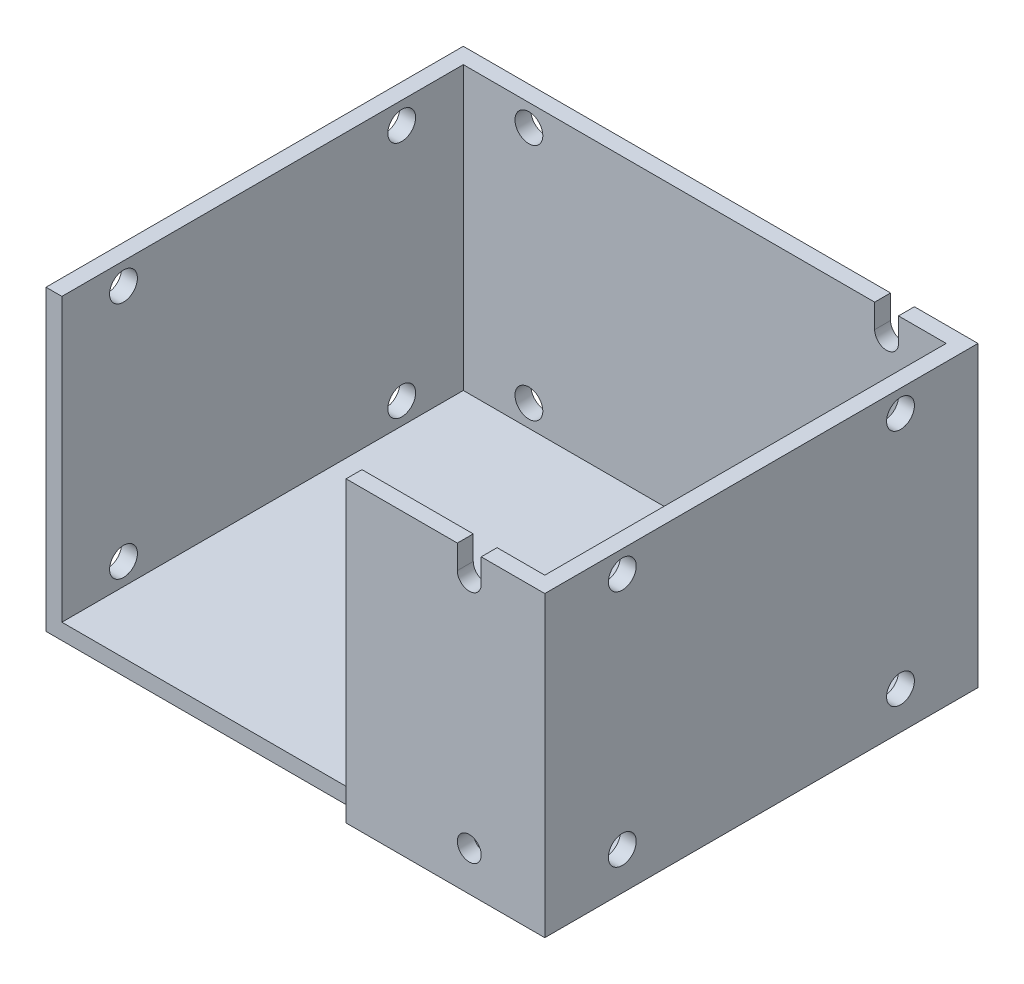
ISO-10303-21;
HEADER;
FILE_DESCRIPTION(('STEP AP214'),'2;1');
FILE_NAME('part.step','',(''),(''),'','','');
FILE_SCHEMA(('AUTOMOTIVE_DESIGN { 1 0 10303 214 1 1 1 1 }'));
ENDSEC;
DATA;
#1=APPLICATION_CONTEXT('core data for automotive mechanical design processes');
#2=APPLICATION_PROTOCOL_DEFINITION('international standard','automotive_design',2000,#1);
#3=PRODUCT_CONTEXT('',#1,'mechanical');
#4=PRODUCT('Part','Part','',(#3));
#5=PRODUCT_RELATED_PRODUCT_CATEGORY('part','',(#4));
#6=PRODUCT_DEFINITION_FORMATION('','',#4);
#7=PRODUCT_DEFINITION_CONTEXT('part definition',#1,'design');
#8=PRODUCT_DEFINITION('design','',#6,#7);
#9=PRODUCT_DEFINITION_SHAPE('','',#8);
#10=(LENGTH_UNIT() NAMED_UNIT(*) SI_UNIT(.MILLI.,.METRE.));
#11=(NAMED_UNIT(*) PLANE_ANGLE_UNIT() SI_UNIT($,.RADIAN.));
#12=(NAMED_UNIT(*) SI_UNIT($,.STERADIAN.) SOLID_ANGLE_UNIT());
#13=UNCERTAINTY_MEASURE_WITH_UNIT(LENGTH_MEASURE(1.E-05),#10,'distance_accuracy_value','');
#14=(GEOMETRIC_REPRESENTATION_CONTEXT(3) GLOBAL_UNCERTAINTY_ASSIGNED_CONTEXT((#13)) GLOBAL_UNIT_ASSIGNED_CONTEXT((#10,
#11,#12)) REPRESENTATION_CONTEXT('',''));
#15=CARTESIAN_POINT('',(0.,0.,0.));
#16=DIRECTION('',(0.,0.,1.));
#17=DIRECTION('',(1.,0.,0.));
#18=AXIS2_PLACEMENT_3D('',#15,#16,#17);
#19=CARTESIAN_POINT('',(0.,75.,0.));
#20=DIRECTION('',(0.,-1.,0.));
#21=DIRECTION('',(0.,0.,-1.));
#22=AXIS2_PLACEMENT_3D('',#19,#20,#21);
#23=PLANE('',#22);
#24=DIRECTION('',(0.,0.,-1.));
#25=VECTOR('',#24,1.);
#26=CARTESIAN_POINT('',(48.75,75.,65.316653826392));
#27=LINE('',#26,#25);
#28=CARTESIAN_POINT('',(48.75,75.,54.5));
#29=VERTEX_POINT('',#28);
#30=CARTESIAN_POINT('',(48.75,75.,50.5));
#31=VERTEX_POINT('',#30);
#32=EDGE_CURVE('E183',#29,#31,#27,.T.);
#33=ORIENTED_EDGE('',*,*,#32,.F.);
#34=DIRECTION('',(1.,0.,0.));
#35=VECTOR('',#34,1.);
#36=CARTESIAN_POINT('',(64.75,75.,54.5));
#37=LINE('',#36,#35);
#38=CARTESIAN_POINT('',(64.75,75.,54.5));
#39=VERTEX_POINT('',#38);
#40=EDGE_CURVE('E331',#29,#39,#37,.T.);
#41=ORIENTED_EDGE('',*,*,#40,.T.);
#42=DIRECTION('',(0.,0.,-1.));
#43=VECTOR('',#42,1.);
#44=CARTESIAN_POINT('',(64.75,75.,-54.5));
#45=LINE('',#44,#43);
#46=CARTESIAN_POINT('',(64.75,75.,-54.5));
#47=VERTEX_POINT('',#46);
#48=EDGE_CURVE('E197',#39,#47,#45,.T.);
#49=ORIENTED_EDGE('',*,*,#48,.T.);
#50=DIRECTION('',(-1.,0.,0.));
#51=VECTOR('',#50,1.);
#52=CARTESIAN_POINT('',(64.75,75.,-54.5));
#53=LINE('',#52,#51);
#54=CARTESIAN_POINT('',(48.75,75.,-54.5));
#55=VERTEX_POINT('',#54);
#56=EDGE_CURVE('E190',#47,#55,#53,.T.);
#57=ORIENTED_EDGE('',*,*,#56,.T.);
#58=CARTESIAN_POINT('',(48.75,75.,-50.5));
#59=VERTEX_POINT('',#58);
#60=EDGE_CURVE('E171',#59,#55,#27,.T.);
#61=ORIENTED_EDGE('',*,*,#60,.F.);
#62=DIRECTION('',(1.,0.,0.));
#63=VECTOR('',#62,1.);
#64=CARTESIAN_POINT('',(60.75,75.,-50.5));
#65=LINE('',#64,#63);
#66=CARTESIAN_POINT('',(60.75,75.,-50.5));
#67=VERTEX_POINT('',#66);
#68=EDGE_CURVE('E215',#59,#67,#65,.T.);
#69=ORIENTED_EDGE('',*,*,#68,.T.);
#70=DIRECTION('',(0.,0.,1.));
#71=VECTOR('',#70,1.);
#72=CARTESIAN_POINT('',(60.75,75.,50.5));
#73=LINE('',#72,#71);
#74=CARTESIAN_POINT('',(60.75,75.,50.5));
#75=VERTEX_POINT('',#74);
#76=EDGE_CURVE('E220',#67,#75,#73,.T.);
#77=ORIENTED_EDGE('',*,*,#76,.T.);
#78=DIRECTION('',(-1.,0.,0.));
#79=VECTOR('',#78,1.);
#80=CARTESIAN_POINT('',(14.75,75.,50.5));
#81=LINE('',#80,#79);
#82=EDGE_CURVE('E332',#75,#31,#81,.T.);
#83=ORIENTED_EDGE('',*,*,#82,.T.);
#84=EDGE_LOOP('',(#33,#41,#49,#57,#61,#69,#77,#83));
#85=FACE_BOUND('',#84,.T.);
#86=ADVANCED_FACE('F39',(#85),#23,.F.);
#87=CARTESIAN_POINT('',(14.75,75.,54.5));
#88=VERTEX_POINT('',#87);
#89=CARTESIAN_POINT('',(42.75,75.,54.5));
#90=VERTEX_POINT('',#89);
#91=EDGE_CURVE('E312',#88,#90,#37,.T.);
#92=ORIENTED_EDGE('',*,*,#91,.T.);
#93=DIRECTION('',(0.,0.,-1.));
#94=VECTOR('',#93,1.);
#95=CARTESIAN_POINT('',(42.75,75.,65.316653826392));
#96=LINE('',#95,#94);
#97=CARTESIAN_POINT('',(42.75,75.,50.5));
#98=VERTEX_POINT('',#97);
#99=EDGE_CURVE('E66',#90,#98,#96,.T.);
#100=ORIENTED_EDGE('',*,*,#99,.T.);
#101=CARTESIAN_POINT('',(14.75,75.,50.5));
#102=VERTEX_POINT('',#101);
#103=EDGE_CURVE('E306',#98,#102,#81,.T.);
#104=ORIENTED_EDGE('',*,*,#103,.T.);
#105=DIRECTION('',(0.,0.,1.));
#106=VECTOR('',#105,1.);
#107=CARTESIAN_POINT('',(14.75,75.,54.5));
#108=LINE('',#107,#106);
#109=EDGE_CURVE('E328',#102,#88,#108,.T.);
#110=ORIENTED_EDGE('',*,*,#109,.T.);
#111=EDGE_LOOP('',(#92,#100,#104,#110));
#112=FACE_BOUND('',#111,.T.);
#113=ADVANCED_FACE('F529',(#112),#23,.F.);
#114=CARTESIAN_POINT('',(-60.75,4.,50.5));
#115=DIRECTION('',(0.,0.,-1.));
#116=DIRECTION('',(-1.,0.,0.));
#117=AXIS2_PLACEMENT_3D('',#114,#115,#116);
#118=PLANE('',#117);
#119=DIRECTION('',(0.,-1.,0.));
#120=VECTOR('',#119,1.);
#121=CARTESIAN_POINT('',(14.75,75.,50.5));
#122=LINE('',#121,#120);
#123=CARTESIAN_POINT('',(14.75,4.,50.5));
#124=VERTEX_POINT('',#123);
#125=CARTESIAN_POINT('',(14.75,0.,50.5));
#126=VERTEX_POINT('',#125);
#127=EDGE_CURVE('E11',#124,#126,#122,.T.);
#128=ORIENTED_EDGE('',*,*,#127,.F.);
#129=DIRECTION('',(1.,0.,0.));
#130=VECTOR('',#129,1.);
#131=CARTESIAN_POINT('',(-60.75,4.,50.5));
#132=LINE('',#131,#130);
#133=CARTESIAN_POINT('',(-60.75,4.,50.5));
#134=VERTEX_POINT('',#133);
#135=EDGE_CURVE('E261',#134,#124,#132,.T.);
#136=ORIENTED_EDGE('',*,*,#135,.F.);
#137=DIRECTION('',(0.,-1.,0.));
#138=VECTOR('',#137,1.);
#139=CARTESIAN_POINT('',(-60.75,75.,50.5));
#140=LINE('',#139,#138);
#141=CARTESIAN_POINT('',(-60.75,75.,50.5));
#142=VERTEX_POINT('',#141);
#143=EDGE_CURVE('E250',#142,#134,#140,.T.);
#144=ORIENTED_EDGE('',*,*,#143,.F.);
#145=DIRECTION('',(1.,0.,0.));
#146=VECTOR('',#145,1.);
#147=CARTESIAN_POINT('',(-60.75,75.,50.5));
#148=LINE('',#147,#146);
#149=CARTESIAN_POINT('',(-64.75,75.,50.5));
#150=VERTEX_POINT('',#149);
#151=EDGE_CURVE('E205',#150,#142,#148,.T.);
#152=ORIENTED_EDGE('',*,*,#151,.F.);
#153=DIRECTION('',(0.,-1.,0.));
#154=VECTOR('',#153,1.);
#155=CARTESIAN_POINT('',(-64.75,75.,50.5));
#156=LINE('',#155,#154);
#157=CARTESIAN_POINT('',(-64.75,0.,50.5));
#158=VERTEX_POINT('',#157);
#159=EDGE_CURVE('E253',#150,#158,#156,.T.);
#160=ORIENTED_EDGE('',*,*,#159,.T.);
#161=DIRECTION('',(1.,0.,0.));
#162=VECTOR('',#161,1.);
#163=CARTESIAN_POINT('',(-60.75,0.,50.5));
#164=LINE('',#163,#162);
#165=EDGE_CURVE('E43',#158,#126,#164,.T.);
#166=ORIENTED_EDGE('',*,*,#165,.T.);
#167=EDGE_LOOP('',(#128,#136,#144,#152,#160,#166));
#168=FACE_BOUND('',#167,.T.);
#169=ADVANCED_FACE('F41',(#168),#118,.F.);
#170=CARTESIAN_POINT('',(0.,4.,0.));
#171=DIRECTION('',(0.,-1.,0.));
#172=DIRECTION('',(0.,0.,-1.));
#173=AXIS2_PLACEMENT_3D('',#170,#171,#172);
#174=PLANE('',#173);
#175=ORIENTED_EDGE('',*,*,#135,.T.);
#176=CARTESIAN_POINT('',(60.75,4.,50.5));
#177=VERTEX_POINT('',#176);
#178=EDGE_CURVE('E266',#124,#177,#132,.T.);
#179=ORIENTED_EDGE('',*,*,#178,.T.);
#180=DIRECTION('',(0.,0.,1.));
#181=VECTOR('',#180,1.);
#182=CARTESIAN_POINT('',(60.75,4.,-50.5));
#183=LINE('',#182,#181);
#184=CARTESIAN_POINT('',(60.75,4.,-50.5));
#185=VERTEX_POINT('',#184);
#186=EDGE_CURVE('E265',#185,#177,#183,.T.);
#187=ORIENTED_EDGE('',*,*,#186,.F.);
#188=DIRECTION('',(1.,0.,0.));
#189=VECTOR('',#188,1.);
#190=CARTESIAN_POINT('',(-60.75,4.,-50.5));
#191=LINE('',#190,#189);
#192=CARTESIAN_POINT('',(-60.75,4.,-50.5));
#193=VERTEX_POINT('',#192);
#194=EDGE_CURVE('E270',#193,#185,#191,.T.);
#195=ORIENTED_EDGE('',*,*,#194,.F.);
#196=DIRECTION('',(0.,0.,1.));
#197=VECTOR('',#196,1.);
#198=CARTESIAN_POINT('',(-60.75,4.,-50.5));
#199=LINE('',#198,#197);
#200=EDGE_CURVE('E49',#193,#134,#199,.T.);
#201=ORIENTED_EDGE('',*,*,#200,.T.);
#202=EDGE_LOOP('',(#175,#179,#187,#195,#201));
#203=FACE_BOUND('',#202,.T.);
#204=ADVANCED_FACE('F277',(#203),#174,.F.);
#205=CARTESIAN_POINT('',(0.,0.,0.));
#206=DIRECTION('',(0.,-1.,0.));
#207=DIRECTION('',(0.,0.,-1.));
#208=AXIS2_PLACEMENT_3D('',#205,#206,#207);
#209=PLANE('',#208);
#210=ORIENTED_EDGE('',*,*,#165,.F.);
#211=DIRECTION('',(0.,0.,1.));
#212=VECTOR('',#211,1.);
#213=CARTESIAN_POINT('',(-64.75,0.,50.5));
#214=LINE('',#213,#212);
#215=CARTESIAN_POINT('',(-64.75,0.,-54.5));
#216=VERTEX_POINT('',#215);
#217=EDGE_CURVE('E229',#216,#158,#214,.T.);
#218=ORIENTED_EDGE('',*,*,#217,.F.);
#219=DIRECTION('',(-1.,0.,0.));
#220=VECTOR('',#219,1.);
#221=CARTESIAN_POINT('',(-64.75,0.,-54.5));
#222=LINE('',#221,#220);
#223=CARTESIAN_POINT('',(64.75,0.,-54.5));
#224=VERTEX_POINT('',#223);
#225=EDGE_CURVE('E226',#224,#216,#222,.T.);
#226=ORIENTED_EDGE('',*,*,#225,.F.);
#227=DIRECTION('',(0.,0.,-1.));
#228=VECTOR('',#227,1.);
#229=CARTESIAN_POINT('',(64.75,0.,-54.5));
#230=LINE('',#229,#228);
#231=CARTESIAN_POINT('',(64.75,0.,54.5));
#232=VERTEX_POINT('',#231);
#233=EDGE_CURVE('E207',#232,#224,#230,.T.);
#234=ORIENTED_EDGE('',*,*,#233,.F.);
#235=DIRECTION('',(1.,0.,0.));
#236=VECTOR('',#235,1.);
#237=CARTESIAN_POINT('',(64.75,0.,54.5));
#238=LINE('',#237,#236);
#239=CARTESIAN_POINT('',(14.75,0.,54.5));
#240=VERTEX_POINT('',#239);
#241=EDGE_CURVE('E300',#240,#232,#238,.T.);
#242=ORIENTED_EDGE('',*,*,#241,.F.);
#243=DIRECTION('',(0.,0.,1.));
#244=VECTOR('',#243,1.);
#245=CARTESIAN_POINT('',(14.75,0.,54.5));
#246=LINE('',#245,#244);
#247=EDGE_CURVE('E291',#126,#240,#246,.T.);
#248=ORIENTED_EDGE('',*,*,#247,.F.);
#249=EDGE_LOOP('',(#210,#218,#226,#234,#242,#248));
#250=FACE_BOUND('',#249,.T.);
#251=ADVANCED_FACE('F297',(#250),#209,.T.);
#252=CARTESIAN_POINT('',(-60.75,75.,-50.5));
#253=DIRECTION('',(-1.,0.,0.));
#254=DIRECTION('',(0.,0.,1.));
#255=AXIS2_PLACEMENT_3D('',#252,#253,#254);
#256=PLANE('',#255);
#257=CARTESIAN_POINT('',(-60.75,69.5,-35.));
#258=DIRECTION('',(-1.,0.,0.));
#259=DIRECTION('',(0.,0.,1.));
#260=AXIS2_PLACEMENT_3D('',#257,#258,#259);
#261=CIRCLE('',#260,3.5);
#262=CARTESIAN_POINT('',(-60.75,69.5,-31.5));
#263=VERTEX_POINT('',#262);
#264=EDGE_CURVE('E302',#263,#263,#261,.T.);
#265=ORIENTED_EDGE('',*,*,#264,.T.);
#266=EDGE_LOOP('',(#265));
#267=FACE_BOUND('',#266,.T.);
#268=CARTESIAN_POINT('',(-60.75,9.50000000000001,35.));
#269=DIRECTION('',(-1.,0.,0.));
#270=DIRECTION('',(0.,0.,1.));
#271=AXIS2_PLACEMENT_3D('',#268,#269,#270);
#272=CIRCLE('',#271,3.50000000000001);
#273=CARTESIAN_POINT('',(-60.75,9.50000000000001,38.5));
#274=VERTEX_POINT('',#273);
#275=EDGE_CURVE('E361',#274,#274,#272,.T.);
#276=ORIENTED_EDGE('',*,*,#275,.T.);
#277=EDGE_LOOP('',(#276));
#278=FACE_BOUND('',#277,.T.);
#279=CARTESIAN_POINT('',(-60.75,9.50000000000001,-35.));
#280=DIRECTION('',(-1.,0.,0.));
#281=DIRECTION('',(0.,0.,1.));
#282=AXIS2_PLACEMENT_3D('',#279,#280,#281);
#283=CIRCLE('',#282,3.5);
#284=CARTESIAN_POINT('',(-60.75,9.50000000000001,-31.5));
#285=VERTEX_POINT('',#284);
#286=EDGE_CURVE('E369',#285,#285,#283,.T.);
#287=ORIENTED_EDGE('',*,*,#286,.T.);
#288=EDGE_LOOP('',(#287));
#289=FACE_BOUND('',#288,.T.);
#290=CARTESIAN_POINT('',(-60.75,69.5,35.));
#291=DIRECTION('',(-1.,0.,0.));
#292=DIRECTION('',(0.,0.,1.));
#293=AXIS2_PLACEMENT_3D('',#290,#291,#292);
#294=CIRCLE('',#293,3.49999999999999);
#295=CARTESIAN_POINT('',(-60.75,69.5,38.5));
#296=VERTEX_POINT('',#295);
#297=EDGE_CURVE('E377',#296,#296,#294,.T.);
#298=ORIENTED_EDGE('',*,*,#297,.T.);
#299=EDGE_LOOP('',(#298));
#300=FACE_BOUND('',#299,.T.);
#301=ORIENTED_EDGE('',*,*,#143,.T.);
#302=ORIENTED_EDGE('',*,*,#200,.F.);
#303=DIRECTION('',(0.,-1.,0.));
#304=VECTOR('',#303,1.);
#305=CARTESIAN_POINT('',(-60.75,75.,-50.5));
#306=LINE('',#305,#304);
#307=CARTESIAN_POINT('',(-60.75,75.,-50.5));
#308=VERTEX_POINT('',#307);
#309=EDGE_CURVE('E246',#308,#193,#306,.T.);
#310=ORIENTED_EDGE('',*,*,#309,.F.);
#311=DIRECTION('',(0.,0.,-1.));
#312=VECTOR('',#311,1.);
#313=CARTESIAN_POINT('',(-60.75,75.,-50.5));
#314=LINE('',#313,#312);
#315=EDGE_CURVE('E212',#142,#308,#314,.T.);
#316=ORIENTED_EDGE('',*,*,#315,.F.);
#317=EDGE_LOOP('',(#301,#302,#310,#316));
#318=FACE_BOUND('',#317,.T.);
#319=ADVANCED_FACE('F517',(#267,#278,#289,#300,#318),#256,.F.);
#320=CARTESIAN_POINT('',(60.75,75.,-50.5));
#321=DIRECTION('',(0.,0.,-1.));
#322=DIRECTION('',(-1.,0.,0.));
#323=AXIS2_PLACEMENT_3D('',#320,#321,#322);
#324=PLANE('',#323);
#325=DIRECTION('',(0.,1.,0.));
#326=VECTOR('',#325,1.);
#327=CARTESIAN_POINT('',(48.75,75.,-50.5));
#328=LINE('',#327,#326);
#329=CARTESIAN_POINT('',(48.75,69.,-50.5));
#330=VERTEX_POINT('',#329);
#331=EDGE_CURVE('E178',#330,#59,#328,.T.);
#332=ORIENTED_EDGE('',*,*,#331,.F.);
#333=CARTESIAN_POINT('',(45.75,69.,-50.5));
#334=DIRECTION('',(0.,0.,-1.));
#335=DIRECTION('',(-1.,0.,0.));
#336=AXIS2_PLACEMENT_3D('',#333,#334,#335);
#337=CIRCLE('',#336,3.);
#338=CARTESIAN_POINT('',(42.75,69.,-50.5));
#339=VERTEX_POINT('',#338);
#340=EDGE_CURVE('E437',#339,#330,#337,.F.);
#341=ORIENTED_EDGE('',*,*,#340,.F.);
#342=DIRECTION('',(0.,1.,0.));
#343=VECTOR('',#342,1.);
#344=CARTESIAN_POINT('',(42.75,75.,-50.5));
#345=LINE('',#344,#343);
#346=CARTESIAN_POINT('',(42.75,75.,-50.5));
#347=VERTEX_POINT('',#346);
#348=EDGE_CURVE('E443',#339,#347,#345,.T.);
#349=ORIENTED_EDGE('',*,*,#348,.T.);
#350=EDGE_CURVE('E216',#308,#347,#65,.T.);
#351=ORIENTED_EDGE('',*,*,#350,.F.);
#352=ORIENTED_EDGE('',*,*,#309,.T.);
#353=ORIENTED_EDGE('',*,*,#194,.T.);
#354=DIRECTION('',(0.,-1.,0.));
#355=VECTOR('',#354,1.);
#356=CARTESIAN_POINT('',(60.75,75.,-50.5));
#357=LINE('',#356,#355);
#358=EDGE_CURVE('E242',#67,#185,#357,.T.);
#359=ORIENTED_EDGE('',*,*,#358,.F.);
#360=ORIENTED_EDGE('',*,*,#68,.F.);
#361=EDGE_LOOP('',(#332,#341,#349,#351,#352,#353,#359,#360));
#362=FACE_BOUND('',#361,.T.);
#363=CARTESIAN_POINT('',(45.75,10.,-50.5));
#364=DIRECTION('',(0.,0.,-1.));
#365=DIRECTION('',(-1.,0.,0.));
#366=AXIS2_PLACEMENT_3D('',#363,#364,#365);
#367=CIRCLE('',#366,3.);
#368=CARTESIAN_POINT('',(42.75,10.,-50.5));
#369=VERTEX_POINT('',#368);
#370=EDGE_CURVE('E450',#369,#369,#367,.F.);
#371=ORIENTED_EDGE('',*,*,#370,.F.);
#372=EDGE_LOOP('',(#371));
#373=FACE_BOUND('',#372,.T.);
#374=CARTESIAN_POINT('',(-44.25,69.5,-50.5));
#375=DIRECTION('',(0.,0.,-1.));
#376=DIRECTION('',(-1.,0.,0.));
#377=AXIS2_PLACEMENT_3D('',#374,#375,#376);
#378=CIRCLE('',#377,3.5);
#379=CARTESIAN_POINT('',(-47.75,69.5,-50.5));
#380=VERTEX_POINT('',#379);
#381=EDGE_CURVE('E403',#380,#380,#378,.F.);
#382=ORIENTED_EDGE('',*,*,#381,.F.);
#383=EDGE_LOOP('',(#382));
#384=FACE_BOUND('',#383,.T.);
#385=CARTESIAN_POINT('',(-44.25,9.5,-50.5));
#386=DIRECTION('',(0.,0.,-1.));
#387=DIRECTION('',(-1.,0.,0.));
#388=AXIS2_PLACEMENT_3D('',#385,#386,#387);
#389=CIRCLE('',#388,3.5);
#390=CARTESIAN_POINT('',(-47.75,9.5,-50.5));
#391=VERTEX_POINT('',#390);
#392=EDGE_CURVE('E418',#391,#391,#389,.F.);
#393=ORIENTED_EDGE('',*,*,#392,.F.);
#394=EDGE_LOOP('',(#393));
#395=FACE_BOUND('',#394,.T.);
#396=ADVANCED_FACE('F348',(#362,#373,#384,#395),#324,.F.);
#397=CARTESIAN_POINT('',(60.75,75.,50.5));
#398=DIRECTION('',(1.,0.,0.));
#399=DIRECTION('',(0.,0.,-1.));
#400=AXIS2_PLACEMENT_3D('',#397,#398,#399);
#401=PLANE('',#400);
#402=CARTESIAN_POINT('',(60.75,69.5,-35.));
#403=DIRECTION('',(1.,0.,0.));
#404=DIRECTION('',(0.,0.,-1.));
#405=AXIS2_PLACEMENT_3D('',#402,#403,#404);
#406=CIRCLE('',#405,3.5);
#407=CARTESIAN_POINT('',(60.75,69.5,-38.5));
#408=VERTEX_POINT('',#407);
#409=EDGE_CURVE('E309',#408,#408,#406,.T.);
#410=ORIENTED_EDGE('',*,*,#409,.T.);
#411=EDGE_LOOP('',(#410));
#412=FACE_BOUND('',#411,.T.);
#413=CARTESIAN_POINT('',(60.75,9.50000000000001,35.));
#414=DIRECTION('',(1.,0.,0.));
#415=DIRECTION('',(0.,0.,-1.));
#416=AXIS2_PLACEMENT_3D('',#413,#414,#415);
#417=CIRCLE('',#416,3.50000000000001);
#418=CARTESIAN_POINT('',(60.75,9.50000000000001,31.5));
#419=VERTEX_POINT('',#418);
#420=EDGE_CURVE('E365',#419,#419,#417,.T.);
#421=ORIENTED_EDGE('',*,*,#420,.T.);
#422=EDGE_LOOP('',(#421));
#423=FACE_BOUND('',#422,.T.);
#424=CARTESIAN_POINT('',(60.75,9.50000000000001,-35.));
#425=DIRECTION('',(1.,0.,0.));
#426=DIRECTION('',(0.,0.,-1.));
#427=AXIS2_PLACEMENT_3D('',#424,#425,#426);
#428=CIRCLE('',#427,3.5);
#429=CARTESIAN_POINT('',(60.75,9.50000000000001,-38.5));
#430=VERTEX_POINT('',#429);
#431=EDGE_CURVE('E373',#430,#430,#428,.T.);
#432=ORIENTED_EDGE('',*,*,#431,.T.);
#433=EDGE_LOOP('',(#432));
#434=FACE_BOUND('',#433,.T.);
#435=CARTESIAN_POINT('',(60.75,69.5,35.));
#436=DIRECTION('',(1.,0.,0.));
#437=DIRECTION('',(0.,0.,-1.));
#438=AXIS2_PLACEMENT_3D('',#435,#436,#437);
#439=CIRCLE('',#438,3.49999999999999);
#440=CARTESIAN_POINT('',(60.75,69.5,31.5));
#441=VERTEX_POINT('',#440);
#442=EDGE_CURVE('E381',#441,#441,#439,.T.);
#443=ORIENTED_EDGE('',*,*,#442,.T.);
#444=EDGE_LOOP('',(#443));
#445=FACE_BOUND('',#444,.T.);
#446=ORIENTED_EDGE('',*,*,#358,.T.);
#447=ORIENTED_EDGE('',*,*,#186,.T.);
#448=DIRECTION('',(0.,-1.,0.));
#449=VECTOR('',#448,1.);
#450=CARTESIAN_POINT('',(60.75,75.,50.5));
#451=LINE('',#450,#449);
#452=EDGE_CURVE('E238',#75,#177,#451,.T.);
#453=ORIENTED_EDGE('',*,*,#452,.F.);
#454=ORIENTED_EDGE('',*,*,#76,.F.);
#455=EDGE_LOOP('',(#446,#447,#453,#454));
#456=FACE_BOUND('',#455,.T.);
#457=ADVANCED_FACE('F351',(#412,#423,#434,#445,#456),#401,.F.);
#458=CARTESIAN_POINT('',(-64.75,75.,-54.5));
#459=DIRECTION('',(0.,0.,1.));
#460=DIRECTION('',(1.,0.,0.));
#461=AXIS2_PLACEMENT_3D('',#458,#459,#460);
#462=PLANE('',#461);
#463=DIRECTION('',(0.,1.,0.));
#464=VECTOR('',#463,1.);
#465=CARTESIAN_POINT('',(48.75,75.,-54.5));
#466=LINE('',#465,#464);
#467=CARTESIAN_POINT('',(48.75,69.,-54.5));
#468=VERTEX_POINT('',#467);
#469=EDGE_CURVE('E175',#468,#55,#466,.T.);
#470=ORIENTED_EDGE('',*,*,#469,.T.);
#471=ORIENTED_EDGE('',*,*,#56,.F.);
#472=DIRECTION('',(0.,-1.,0.));
#473=VECTOR('',#472,1.);
#474=CARTESIAN_POINT('',(64.75,75.,-54.5));
#475=LINE('',#474,#473);
#476=EDGE_CURVE('E225',#47,#224,#475,.T.);
#477=ORIENTED_EDGE('',*,*,#476,.T.);
#478=ORIENTED_EDGE('',*,*,#225,.T.);
#479=DIRECTION('',(0.,-1.,0.));
#480=VECTOR('',#479,1.);
#481=CARTESIAN_POINT('',(-64.75,75.,-54.5));
#482=LINE('',#481,#480);
#483=CARTESIAN_POINT('',(-64.75,75.,-54.5));
#484=VERTEX_POINT('',#483);
#485=EDGE_CURVE('E257',#484,#216,#482,.T.);
#486=ORIENTED_EDGE('',*,*,#485,.F.);
#487=CARTESIAN_POINT('',(42.75,75.,-54.5));
#488=VERTEX_POINT('',#487);
#489=EDGE_CURVE('E201',#488,#484,#53,.T.);
#490=ORIENTED_EDGE('',*,*,#489,.F.);
#491=DIRECTION('',(0.,1.,0.));
#492=VECTOR('',#491,1.);
#493=CARTESIAN_POINT('',(42.75,75.,-54.5));
#494=LINE('',#493,#492);
#495=CARTESIAN_POINT('',(42.75,69.,-54.5));
#496=VERTEX_POINT('',#495);
#497=EDGE_CURVE('E58',#496,#488,#494,.T.);
#498=ORIENTED_EDGE('',*,*,#497,.F.);
#499=CARTESIAN_POINT('',(45.75,69.,-54.5));
#500=DIRECTION('',(0.,0.,1.));
#501=DIRECTION('',(1.,0.,0.));
#502=AXIS2_PLACEMENT_3D('',#499,#500,#501);
#503=CIRCLE('',#502,3.);
#504=EDGE_CURVE('E192',#496,#468,#503,.T.);
#505=ORIENTED_EDGE('',*,*,#504,.T.);
#506=EDGE_LOOP('',(#470,#471,#477,#478,#486,#490,#498,#505));
#507=FACE_BOUND('',#506,.T.);
#508=CARTESIAN_POINT('',(45.75,10.,-54.5));
#509=DIRECTION('',(0.,0.,1.));
#510=DIRECTION('',(1.,0.,0.));
#511=AXIS2_PLACEMENT_3D('',#508,#509,#510);
#512=CIRCLE('',#511,3.);
#513=CARTESIAN_POINT('',(48.75,10.,-54.5));
#514=VERTEX_POINT('',#513);
#515=EDGE_CURVE('E463',#514,#514,#512,.T.);
#516=ORIENTED_EDGE('',*,*,#515,.T.);
#517=EDGE_LOOP('',(#516));
#518=FACE_BOUND('',#517,.T.);
#519=CARTESIAN_POINT('',(-44.25,69.5,-54.5));
#520=DIRECTION('',(0.,0.,-1.));
#521=DIRECTION('',(-1.,0.,0.));
#522=AXIS2_PLACEMENT_3D('',#519,#520,#521);
#523=CIRCLE('',#522,3.5);
#524=CARTESIAN_POINT('',(-47.75,69.5,-54.5));
#525=VERTEX_POINT('',#524);
#526=EDGE_CURVE('E422',#525,#525,#523,.T.);
#527=ORIENTED_EDGE('',*,*,#526,.F.);
#528=EDGE_LOOP('',(#527));
#529=FACE_BOUND('',#528,.T.);
#530=CARTESIAN_POINT('',(-44.25,9.5,-54.5));
#531=DIRECTION('',(0.,0.,-1.));
#532=DIRECTION('',(-1.,0.,0.));
#533=AXIS2_PLACEMENT_3D('',#530,#531,#532);
#534=CIRCLE('',#533,3.5);
#535=CARTESIAN_POINT('',(-47.75,9.5,-54.5));
#536=VERTEX_POINT('',#535);
#537=EDGE_CURVE('E423',#536,#536,#534,.T.);
#538=ORIENTED_EDGE('',*,*,#537,.F.);
#539=EDGE_LOOP('',(#538));
#540=FACE_BOUND('',#539,.T.);
#541=ADVANCED_FACE('F187',(#507,#518,#529,#540),#462,.F.);
#542=CARTESIAN_POINT('',(-64.75,75.,50.5));
#543=DIRECTION('',(1.,0.,0.));
#544=DIRECTION('',(0.,0.,-1.));
#545=AXIS2_PLACEMENT_3D('',#542,#543,#544);
#546=PLANE('',#545);
#547=CARTESIAN_POINT('',(-64.75,69.5,-35.));
#548=DIRECTION('',(1.,0.,0.));
#549=DIRECTION('',(0.,0.,-1.));
#550=AXIS2_PLACEMENT_3D('',#547,#548,#549);
#551=CIRCLE('',#550,3.5);
#552=CARTESIAN_POINT('',(-64.75,69.5,-38.5));
#553=VERTEX_POINT('',#552);
#554=EDGE_CURVE('E399',#553,#553,#551,.F.);
#555=ORIENTED_EDGE('',*,*,#554,.F.);
#556=EDGE_LOOP('',(#555));
#557=FACE_BOUND('',#556,.T.);
#558=CARTESIAN_POINT('',(-64.75,9.50000000000001,35.));
#559=DIRECTION('',(1.,0.,0.));
#560=DIRECTION('',(0.,0.,-1.));
#561=AXIS2_PLACEMENT_3D('',#558,#559,#560);
#562=CIRCLE('',#561,3.50000000000001);
#563=CARTESIAN_POINT('',(-64.75,9.50000000000001,31.5));
#564=VERTEX_POINT('',#563);
#565=EDGE_CURVE('E398',#564,#564,#562,.F.);
#566=ORIENTED_EDGE('',*,*,#565,.F.);
#567=EDGE_LOOP('',(#566));
#568=FACE_BOUND('',#567,.T.);
#569=CARTESIAN_POINT('',(-64.75,9.50000000000001,-35.));
#570=DIRECTION('',(1.,0.,0.));
#571=DIRECTION('',(0.,0.,-1.));
#572=AXIS2_PLACEMENT_3D('',#569,#570,#571);
#573=CIRCLE('',#572,3.5);
#574=CARTESIAN_POINT('',(-64.75,9.50000000000001,-38.5));
#575=VERTEX_POINT('',#574);
#576=EDGE_CURVE('E408',#575,#575,#573,.F.);
#577=ORIENTED_EDGE('',*,*,#576,.F.);
#578=EDGE_LOOP('',(#577));
#579=FACE_BOUND('',#578,.T.);
#580=CARTESIAN_POINT('',(-64.75,69.5,35.));
#581=DIRECTION('',(1.,0.,0.));
#582=DIRECTION('',(0.,0.,-1.));
#583=AXIS2_PLACEMENT_3D('',#580,#581,#582);
#584=CIRCLE('',#583,3.49999999999999);
#585=CARTESIAN_POINT('',(-64.75,69.5,31.5));
#586=VERTEX_POINT('',#585);
#587=EDGE_CURVE('E385',#586,#586,#584,.F.);
#588=ORIENTED_EDGE('',*,*,#587,.F.);
#589=EDGE_LOOP('',(#588));
#590=FACE_BOUND('',#589,.T.);
#591=ORIENTED_EDGE('',*,*,#217,.T.);
#592=ORIENTED_EDGE('',*,*,#159,.F.);
#593=DIRECTION('',(0.,0.,1.));
#594=VECTOR('',#593,1.);
#595=CARTESIAN_POINT('',(-64.75,75.,50.5));
#596=LINE('',#595,#594);
#597=EDGE_CURVE('E200',#484,#150,#596,.T.);
#598=ORIENTED_EDGE('',*,*,#597,.F.);
#599=ORIENTED_EDGE('',*,*,#485,.T.);
#600=EDGE_LOOP('',(#591,#592,#598,#599));
#601=FACE_BOUND('',#600,.T.);
#602=ADVANCED_FACE('F504',(#557,#568,#579,#590,#601),#546,.F.);
#603=CARTESIAN_POINT('',(64.75,75.,-54.5));
#604=DIRECTION('',(-1.,0.,0.));
#605=DIRECTION('',(0.,0.,1.));
#606=AXIS2_PLACEMENT_3D('',#603,#604,#605);
#607=PLANE('',#606);
#608=CARTESIAN_POINT('',(64.75,69.5,-35.));
#609=DIRECTION('',(1.,0.,0.));
#610=DIRECTION('',(0.,0.,-1.));
#611=AXIS2_PLACEMENT_3D('',#608,#609,#610);
#612=CIRCLE('',#611,3.5);
#613=CARTESIAN_POINT('',(64.75,69.5,-38.5));
#614=VERTEX_POINT('',#613);
#615=EDGE_CURVE('E394',#614,#614,#612,.T.);
#616=ORIENTED_EDGE('',*,*,#615,.F.);
#617=EDGE_LOOP('',(#616));
#618=FACE_BOUND('',#617,.T.);
#619=CARTESIAN_POINT('',(64.75,9.50000000000001,35.));
#620=DIRECTION('',(1.,0.,0.));
#621=DIRECTION('',(0.,0.,-1.));
#622=AXIS2_PLACEMENT_3D('',#619,#620,#621);
#623=CIRCLE('',#622,3.50000000000001);
#624=CARTESIAN_POINT('',(64.75,9.50000000000001,31.5));
#625=VERTEX_POINT('',#624);
#626=EDGE_CURVE('E404',#625,#625,#623,.T.);
#627=ORIENTED_EDGE('',*,*,#626,.F.);
#628=EDGE_LOOP('',(#627));
#629=FACE_BOUND('',#628,.T.);
#630=CARTESIAN_POINT('',(64.75,9.50000000000001,-35.));
#631=DIRECTION('',(1.,0.,0.));
#632=DIRECTION('',(0.,0.,-1.));
#633=AXIS2_PLACEMENT_3D('',#630,#631,#632);
#634=CIRCLE('',#633,3.5);
#635=CARTESIAN_POINT('',(64.75,9.50000000000001,-38.5));
#636=VERTEX_POINT('',#635);
#637=EDGE_CURVE('E393',#636,#636,#634,.T.);
#638=ORIENTED_EDGE('',*,*,#637,.F.);
#639=EDGE_LOOP('',(#638));
#640=FACE_BOUND('',#639,.T.);
#641=CARTESIAN_POINT('',(64.75,69.5,35.));
#642=DIRECTION('',(1.,0.,0.));
#643=DIRECTION('',(0.,0.,-1.));
#644=AXIS2_PLACEMENT_3D('',#641,#642,#643);
#645=CIRCLE('',#644,3.49999999999999);
#646=CARTESIAN_POINT('',(64.75,69.5,31.5));
#647=VERTEX_POINT('',#646);
#648=EDGE_CURVE('E389',#647,#647,#645,.T.);
#649=ORIENTED_EDGE('',*,*,#648,.F.);
#650=EDGE_LOOP('',(#649));
#651=FACE_BOUND('',#650,.T.);
#652=ORIENTED_EDGE('',*,*,#233,.T.);
#653=ORIENTED_EDGE('',*,*,#476,.F.);
#654=ORIENTED_EDGE('',*,*,#48,.F.);
#655=DIRECTION('',(0.,-1.,0.));
#656=VECTOR('',#655,1.);
#657=CARTESIAN_POINT('',(64.75,75.,54.5));
#658=LINE('',#657,#656);
#659=EDGE_CURVE('E315',#39,#232,#658,.T.);
#660=ORIENTED_EDGE('',*,*,#659,.T.);
#661=EDGE_LOOP('',(#652,#653,#654,#660));
#662=FACE_BOUND('',#661,.T.);
#663=ADVANCED_FACE('F499',(#618,#629,#640,#651,#662),#607,.F.);
#664=ORIENTED_EDGE('',*,*,#350,.T.);
#665=EDGE_CURVE('E468',#347,#488,#96,.T.);
#666=ORIENTED_EDGE('',*,*,#665,.T.);
#667=ORIENTED_EDGE('',*,*,#489,.T.);
#668=ORIENTED_EDGE('',*,*,#597,.T.);
#669=ORIENTED_EDGE('',*,*,#151,.T.);
#670=ORIENTED_EDGE('',*,*,#315,.T.);
#671=EDGE_LOOP('',(#664,#666,#667,#668,#669,#670));
#672=FACE_BOUND('',#671,.T.);
#673=ADVANCED_FACE('F507',(#672),#23,.F.);
#674=CARTESIAN_POINT('',(14.75,75.,50.5));
#675=DIRECTION('',(0.,0.,1.));
#676=DIRECTION('',(1.,0.,0.));
#677=AXIS2_PLACEMENT_3D('',#674,#675,#676);
#678=PLANE('',#677);
#679=DIRECTION('',(0.,-1.,0.));
#680=VECTOR('',#679,1.);
#681=CARTESIAN_POINT('',(48.75,75.,50.5));
#682=LINE('',#681,#680);
#683=CARTESIAN_POINT('',(48.75,69.,50.5));
#684=VERTEX_POINT('',#683);
#685=EDGE_CURVE('E353',#31,#684,#682,.T.);
#686=ORIENTED_EDGE('',*,*,#685,.F.);
#687=ORIENTED_EDGE('',*,*,#82,.F.);
#688=ORIENTED_EDGE('',*,*,#452,.T.);
#689=ORIENTED_EDGE('',*,*,#178,.F.);
#690=EDGE_CURVE('E51',#102,#124,#122,.T.);
#691=ORIENTED_EDGE('',*,*,#690,.F.);
#692=ORIENTED_EDGE('',*,*,#103,.F.);
#693=DIRECTION('',(0.,-1.,0.));
#694=VECTOR('',#693,1.);
#695=CARTESIAN_POINT('',(42.75,75.,50.5));
#696=LINE('',#695,#694);
#697=CARTESIAN_POINT('',(42.75,69.,50.5));
#698=VERTEX_POINT('',#697);
#699=EDGE_CURVE('E447',#98,#698,#696,.T.);
#700=ORIENTED_EDGE('',*,*,#699,.T.);
#701=CARTESIAN_POINT('',(45.75,69.,50.5));
#702=DIRECTION('',(0.,0.,1.));
#703=DIRECTION('',(1.,0.,0.));
#704=AXIS2_PLACEMENT_3D('',#701,#702,#703);
#705=CIRCLE('',#704,3.);
#706=EDGE_CURVE('E440',#684,#698,#705,.F.);
#707=ORIENTED_EDGE('',*,*,#706,.F.);
#708=EDGE_LOOP('',(#686,#687,#688,#689,#691,#692,#700,#707));
#709=FACE_BOUND('',#708,.T.);
#710=CARTESIAN_POINT('',(45.75,10.,50.5));
#711=DIRECTION('',(0.,0.,1.));
#712=DIRECTION('',(1.,0.,0.));
#713=AXIS2_PLACEMENT_3D('',#710,#711,#712);
#714=CIRCLE('',#713,3.);
#715=CARTESIAN_POINT('',(48.75,10.,50.5));
#716=VERTEX_POINT('',#715);
#717=EDGE_CURVE('E454',#716,#716,#714,.F.);
#718=ORIENTED_EDGE('',*,*,#717,.F.);
#719=EDGE_LOOP('',(#718));
#720=FACE_BOUND('',#719,.T.);
#721=ADVANCED_FACE('F336',(#709,#720),#678,.F.);
#722=CARTESIAN_POINT('',(14.75,75.,54.5));
#723=DIRECTION('',(1.,0.,0.));
#724=DIRECTION('',(0.,0.,-1.));
#725=AXIS2_PLACEMENT_3D('',#722,#723,#724);
#726=PLANE('',#725);
#727=ORIENTED_EDGE('',*,*,#247,.T.);
#728=DIRECTION('',(0.,-1.,0.));
#729=VECTOR('',#728,1.);
#730=CARTESIAN_POINT('',(14.75,75.,54.5));
#731=LINE('',#730,#729);
#732=EDGE_CURVE('E318',#88,#240,#731,.T.);
#733=ORIENTED_EDGE('',*,*,#732,.F.);
#734=ORIENTED_EDGE('',*,*,#109,.F.);
#735=ORIENTED_EDGE('',*,*,#690,.T.);
#736=ORIENTED_EDGE('',*,*,#127,.T.);
#737=EDGE_LOOP('',(#727,#733,#734,#735,#736));
#738=FACE_BOUND('',#737,.T.);
#739=ADVANCED_FACE('F289',(#738),#726,.F.);
#740=CARTESIAN_POINT('',(64.75,75.,54.5));
#741=DIRECTION('',(0.,0.,-1.));
#742=DIRECTION('',(-1.,0.,0.));
#743=AXIS2_PLACEMENT_3D('',#740,#741,#742);
#744=PLANE('',#743);
#745=DIRECTION('',(0.,-1.,0.));
#746=VECTOR('',#745,1.);
#747=CARTESIAN_POINT('',(48.75,75.,54.5));
#748=LINE('',#747,#746);
#749=CARTESIAN_POINT('',(48.75,69.,54.5));
#750=VERTEX_POINT('',#749);
#751=EDGE_CURVE('E481',#29,#750,#748,.T.);
#752=ORIENTED_EDGE('',*,*,#751,.T.);
#753=CARTESIAN_POINT('',(45.75,69.,54.5));
#754=DIRECTION('',(0.,0.,-1.));
#755=DIRECTION('',(-1.,0.,0.));
#756=AXIS2_PLACEMENT_3D('',#753,#754,#755);
#757=CIRCLE('',#756,3.);
#758=CARTESIAN_POINT('',(42.75,69.,54.5));
#759=VERTEX_POINT('',#758);
#760=EDGE_CURVE('E488',#750,#759,#757,.T.);
#761=ORIENTED_EDGE('',*,*,#760,.T.);
#762=DIRECTION('',(0.,-1.,0.));
#763=VECTOR('',#762,1.);
#764=CARTESIAN_POINT('',(42.75,75.,54.5));
#765=LINE('',#764,#763);
#766=EDGE_CURVE('E458',#90,#759,#765,.T.);
#767=ORIENTED_EDGE('',*,*,#766,.F.);
#768=ORIENTED_EDGE('',*,*,#91,.F.);
#769=ORIENTED_EDGE('',*,*,#732,.T.);
#770=ORIENTED_EDGE('',*,*,#241,.T.);
#771=ORIENTED_EDGE('',*,*,#659,.F.);
#772=ORIENTED_EDGE('',*,*,#40,.F.);
#773=EDGE_LOOP('',(#752,#761,#767,#768,#769,#770,#771,#772));
#774=FACE_BOUND('',#773,.T.);
#775=CARTESIAN_POINT('',(45.75,10.,54.5));
#776=DIRECTION('',(0.,0.,-1.));
#777=DIRECTION('',(-1.,0.,0.));
#778=AXIS2_PLACEMENT_3D('',#775,#776,#777);
#779=CIRCLE('',#778,3.);
#780=CARTESIAN_POINT('',(42.75,10.,54.5));
#781=VERTEX_POINT('',#780);
#782=EDGE_CURVE('E459',#781,#781,#779,.T.);
#783=ORIENTED_EDGE('',*,*,#782,.T.);
#784=EDGE_LOOP('',(#783));
#785=FACE_BOUND('',#784,.T.);
#786=ADVANCED_FACE('F324',(#774,#785),#744,.F.);
#787=CARTESIAN_POINT('',(-74.6494949366117,69.5,35.));
#788=DIRECTION('',(1.,0.,0.));
#789=DIRECTION('',(0.,0.,-1.));
#790=AXIS2_PLACEMENT_3D('',#787,#788,#789);
#791=CYLINDRICAL_SURFACE('',#790,3.49999999999999);
#792=ORIENTED_EDGE('',*,*,#648,.T.);
#793=EDGE_LOOP('',(#792));
#794=FACE_BOUND('',#793,.T.);
#795=ORIENTED_EDGE('',*,*,#442,.F.);
#796=EDGE_LOOP('',(#795));
#797=FACE_BOUND('',#796,.T.);
#798=ADVANCED_FACE('F563',(#794,#797),#791,.F.);
#799=CARTESIAN_POINT('',(-74.6494949366117,9.50000000000001,-35.));
#800=DIRECTION('',(1.,0.,0.));
#801=DIRECTION('',(0.,0.,-1.));
#802=AXIS2_PLACEMENT_3D('',#799,#800,#801);
#803=CYLINDRICAL_SURFACE('',#802,3.5);
#804=ORIENTED_EDGE('',*,*,#637,.T.);
#805=EDGE_LOOP('',(#804));
#806=FACE_BOUND('',#805,.T.);
#807=ORIENTED_EDGE('',*,*,#431,.F.);
#808=EDGE_LOOP('',(#807));
#809=FACE_BOUND('',#808,.T.);
#810=ADVANCED_FACE('F565',(#806,#809),#803,.F.);
#811=CARTESIAN_POINT('',(-74.6494949366117,9.50000000000001,35.));
#812=DIRECTION('',(1.,0.,0.));
#813=DIRECTION('',(0.,0.,-1.));
#814=AXIS2_PLACEMENT_3D('',#811,#812,#813);
#815=CYLINDRICAL_SURFACE('',#814,3.50000000000001);
#816=ORIENTED_EDGE('',*,*,#626,.T.);
#817=EDGE_LOOP('',(#816));
#818=FACE_BOUND('',#817,.T.);
#819=ORIENTED_EDGE('',*,*,#420,.F.);
#820=EDGE_LOOP('',(#819));
#821=FACE_BOUND('',#820,.T.);
#822=ADVANCED_FACE('F573',(#818,#821),#815,.F.);
#823=CARTESIAN_POINT('',(-74.6494949366117,69.5,-35.));
#824=DIRECTION('',(1.,0.,0.));
#825=DIRECTION('',(0.,0.,-1.));
#826=AXIS2_PLACEMENT_3D('',#823,#824,#825);
#827=CYLINDRICAL_SURFACE('',#826,3.5);
#828=ORIENTED_EDGE('',*,*,#615,.T.);
#829=EDGE_LOOP('',(#828));
#830=FACE_BOUND('',#829,.T.);
#831=ORIENTED_EDGE('',*,*,#409,.F.);
#832=EDGE_LOOP('',(#831));
#833=FACE_BOUND('',#832,.T.);
#834=ADVANCED_FACE('F580',(#830,#833),#827,.F.);
#835=ORIENTED_EDGE('',*,*,#587,.T.);
#836=EDGE_LOOP('',(#835));
#837=FACE_BOUND('',#836,.T.);
#838=ORIENTED_EDGE('',*,*,#297,.F.);
#839=EDGE_LOOP('',(#838));
#840=FACE_BOUND('',#839,.T.);
#841=ADVANCED_FACE('F568',(#837,#840),#791,.F.);
#842=ORIENTED_EDGE('',*,*,#576,.T.);
#843=EDGE_LOOP('',(#842));
#844=FACE_BOUND('',#843,.T.);
#845=ORIENTED_EDGE('',*,*,#286,.F.);
#846=EDGE_LOOP('',(#845));
#847=FACE_BOUND('',#846,.T.);
#848=ADVANCED_FACE('F576',(#844,#847),#803,.F.);
#849=ORIENTED_EDGE('',*,*,#565,.T.);
#850=EDGE_LOOP('',(#849));
#851=FACE_BOUND('',#850,.T.);
#852=ORIENTED_EDGE('',*,*,#275,.F.);
#853=EDGE_LOOP('',(#852));
#854=FACE_BOUND('',#853,.T.);
#855=ADVANCED_FACE('F586',(#851,#854),#815,.F.);
#856=ORIENTED_EDGE('',*,*,#554,.T.);
#857=EDGE_LOOP('',(#856));
#858=FACE_BOUND('',#857,.T.);
#859=ORIENTED_EDGE('',*,*,#264,.F.);
#860=EDGE_LOOP('',(#859));
#861=FACE_BOUND('',#860,.T.);
#862=ADVANCED_FACE('F589',(#858,#861),#827,.F.);
#863=CARTESIAN_POINT('',(-44.25,9.5,-40.6005050633883));
#864=DIRECTION('',(0.,0.,-1.));
#865=DIRECTION('',(-1.,0.,0.));
#866=AXIS2_PLACEMENT_3D('',#863,#864,#865);
#867=CYLINDRICAL_SURFACE('',#866,3.5);
#868=ORIENTED_EDGE('',*,*,#392,.T.);
#869=EDGE_LOOP('',(#868));
#870=FACE_BOUND('',#869,.T.);
#871=ORIENTED_EDGE('',*,*,#537,.T.);
#872=EDGE_LOOP('',(#871));
#873=FACE_BOUND('',#872,.T.);
#874=ADVANCED_FACE('F602',(#870,#873),#867,.F.);
#875=CARTESIAN_POINT('',(-44.25,69.5,-40.6005050633883));
#876=DIRECTION('',(0.,0.,-1.));
#877=DIRECTION('',(-1.,0.,0.));
#878=AXIS2_PLACEMENT_3D('',#875,#876,#877);
#879=CYLINDRICAL_SURFACE('',#878,3.5);
#880=ORIENTED_EDGE('',*,*,#381,.T.);
#881=EDGE_LOOP('',(#880));
#882=FACE_BOUND('',#881,.T.);
#883=ORIENTED_EDGE('',*,*,#526,.T.);
#884=EDGE_LOOP('',(#883));
#885=FACE_BOUND('',#884,.T.);
#886=ADVANCED_FACE('F608',(#882,#885),#879,.F.);
#887=CARTESIAN_POINT('',(45.75,10.,65.316653826392));
#888=DIRECTION('',(0.,0.,-1.));
#889=DIRECTION('',(-1.,0.,0.));
#890=AXIS2_PLACEMENT_3D('',#887,#888,#889);
#891=CYLINDRICAL_SURFACE('',#890,3.);
#892=ORIENTED_EDGE('',*,*,#782,.F.);
#893=EDGE_LOOP('',(#892));
#894=FACE_BOUND('',#893,.T.);
#895=ORIENTED_EDGE('',*,*,#717,.T.);
#896=EDGE_LOOP('',(#895));
#897=FACE_BOUND('',#896,.T.);
#898=ADVANCED_FACE('F629',(#894,#897),#891,.F.);
#899=CARTESIAN_POINT('',(42.75,75.,65.316653826392));
#900=DIRECTION('',(-1.,0.,0.));
#901=DIRECTION('',(0.,0.,1.));
#902=AXIS2_PLACEMENT_3D('',#899,#900,#901);
#903=PLANE('',#902);
#904=ORIENTED_EDGE('',*,*,#99,.F.);
#905=ORIENTED_EDGE('',*,*,#766,.T.);
#906=DIRECTION('',(0.,0.,-1.));
#907=VECTOR('',#906,1.);
#908=CARTESIAN_POINT('',(42.75,69.,65.316653826392));
#909=LINE('',#908,#907);
#910=EDGE_CURVE('E477',#759,#698,#909,.T.);
#911=ORIENTED_EDGE('',*,*,#910,.T.);
#912=ORIENTED_EDGE('',*,*,#699,.F.);
#913=EDGE_LOOP('',(#904,#905,#911,#912));
#914=FACE_BOUND('',#913,.T.);
#915=ADVANCED_FACE('F637',(#914),#903,.F.);
#916=CARTESIAN_POINT('',(45.75,69.,65.316653826392));
#917=DIRECTION('',(0.,0.,-1.));
#918=DIRECTION('',(-1.,0.,0.));
#919=AXIS2_PLACEMENT_3D('',#916,#917,#918);
#920=CYLINDRICAL_SURFACE('',#919,3.);
#921=ORIENTED_EDGE('',*,*,#706,.T.);
#922=ORIENTED_EDGE('',*,*,#910,.F.);
#923=ORIENTED_EDGE('',*,*,#760,.F.);
#924=DIRECTION('',(0.,0.,-1.));
#925=VECTOR('',#924,1.);
#926=CARTESIAN_POINT('',(48.75,69.,65.316653826392));
#927=LINE('',#926,#925);
#928=EDGE_CURVE('E472',#750,#684,#927,.T.);
#929=ORIENTED_EDGE('',*,*,#928,.T.);
#930=EDGE_LOOP('',(#921,#922,#923,#929));
#931=FACE_BOUND('',#930,.T.);
#932=ADVANCED_FACE('F641',(#931),#920,.F.);
#933=CARTESIAN_POINT('',(48.75,75.,65.316653826392));
#934=DIRECTION('',(-1.,0.,0.));
#935=DIRECTION('',(0.,0.,1.));
#936=AXIS2_PLACEMENT_3D('',#933,#934,#935);
#937=PLANE('',#936);
#938=ORIENTED_EDGE('',*,*,#685,.T.);
#939=ORIENTED_EDGE('',*,*,#928,.F.);
#940=ORIENTED_EDGE('',*,*,#751,.F.);
#941=ORIENTED_EDGE('',*,*,#32,.T.);
#942=EDGE_LOOP('',(#938,#939,#940,#941));
#943=FACE_BOUND('',#942,.T.);
#944=ADVANCED_FACE('F496',(#943),#937,.T.);
#945=ORIENTED_EDGE('',*,*,#331,.T.);
#946=ORIENTED_EDGE('',*,*,#60,.T.);
#947=ORIENTED_EDGE('',*,*,#469,.F.);
#948=EDGE_CURVE('E471',#330,#468,#927,.T.);
#949=ORIENTED_EDGE('',*,*,#948,.F.);
#950=EDGE_LOOP('',(#945,#946,#947,#949));
#951=FACE_BOUND('',#950,.T.);
#952=ADVANCED_FACE('F173',(#951),#937,.T.);
#953=ORIENTED_EDGE('',*,*,#340,.T.);
#954=ORIENTED_EDGE('',*,*,#948,.T.);
#955=ORIENTED_EDGE('',*,*,#504,.F.);
#956=EDGE_CURVE('E476',#339,#496,#909,.T.);
#957=ORIENTED_EDGE('',*,*,#956,.F.);
#958=EDGE_LOOP('',(#953,#954,#955,#957));
#959=FACE_BOUND('',#958,.T.);
#960=ADVANCED_FACE('F516',(#959),#920,.F.);
#961=ORIENTED_EDGE('',*,*,#956,.T.);
#962=ORIENTED_EDGE('',*,*,#497,.T.);
#963=ORIENTED_EDGE('',*,*,#665,.F.);
#964=ORIENTED_EDGE('',*,*,#348,.F.);
#965=EDGE_LOOP('',(#961,#962,#963,#964));
#966=FACE_BOUND('',#965,.T.);
#967=ADVANCED_FACE('F513',(#966),#903,.F.);
#968=ORIENTED_EDGE('',*,*,#515,.F.);
#969=EDGE_LOOP('',(#968));
#970=FACE_BOUND('',#969,.T.);
#971=ORIENTED_EDGE('',*,*,#370,.T.);
#972=EDGE_LOOP('',(#971));
#973=FACE_BOUND('',#972,.T.);
#974=ADVANCED_FACE('F631',(#970,#973),#891,.F.);
#975=CLOSED_SHELL('',(#86,#113,#169,#204,#251,#319,#396,#457,#541,#602,#663,#673,#721,#739,#786,
#798,#810,#822,#834,#841,#848,#855,#862,#874,#886,#898,#915,#932,#944,#952,#960,#967,#974));
#976=MANIFOLD_SOLID_BREP('B2',#975);
#977=ADVANCED_BREP_SHAPE_REPRESENTATION('',(#18,#976),#14);
#978=SHAPE_DEFINITION_REPRESENTATION(#9,#977);
ENDSEC;
END-ISO-10303-21;
